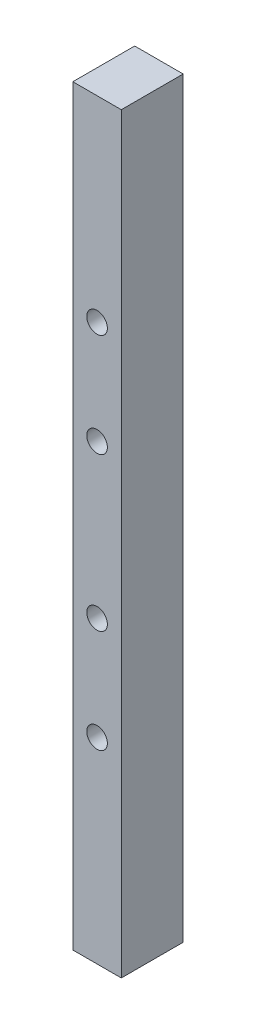
ISO-10303-21;
HEADER;
FILE_DESCRIPTION(('STEP AP214'),'2;1');
FILE_NAME('part.step','',(''),(''),'','','');
FILE_SCHEMA(('AUTOMOTIVE_DESIGN { 1 0 10303 214 1 1 1 1 }'));
ENDSEC;
DATA;
#1=APPLICATION_CONTEXT('core data for automotive mechanical design processes');
#2=APPLICATION_PROTOCOL_DEFINITION('international standard','automotive_design',2000,#1);
#3=PRODUCT_CONTEXT('',#1,'mechanical');
#4=PRODUCT('Part','Part','',(#3));
#5=PRODUCT_RELATED_PRODUCT_CATEGORY('part','',(#4));
#6=PRODUCT_DEFINITION_FORMATION('','',#4);
#7=PRODUCT_DEFINITION_CONTEXT('part definition',#1,'design');
#8=PRODUCT_DEFINITION('design','',#6,#7);
#9=PRODUCT_DEFINITION_SHAPE('','',#8);
#10=(LENGTH_UNIT() NAMED_UNIT(*) SI_UNIT(.MILLI.,.METRE.));
#11=(NAMED_UNIT(*) PLANE_ANGLE_UNIT() SI_UNIT($,.RADIAN.));
#12=(NAMED_UNIT(*) SI_UNIT($,.STERADIAN.) SOLID_ANGLE_UNIT());
#13=UNCERTAINTY_MEASURE_WITH_UNIT(LENGTH_MEASURE(1.E-05),#10,'distance_accuracy_value','');
#14=(GEOMETRIC_REPRESENTATION_CONTEXT(3) GLOBAL_UNCERTAINTY_ASSIGNED_CONTEXT((#13)) GLOBAL_UNIT_ASSIGNED_CONTEXT((#10,
#11,#12)) REPRESENTATION_CONTEXT('',''));
#15=CARTESIAN_POINT('',(0.,0.,0.));
#16=DIRECTION('',(0.,0.,1.));
#17=DIRECTION('',(1.,0.,0.));
#18=AXIS2_PLACEMENT_3D('',#15,#16,#17);
#19=CARTESIAN_POINT('',(0.,0.,6.));
#20=DIRECTION('',(0.,0.,1.));
#21=DIRECTION('',(1.,0.,0.));
#22=AXIS2_PLACEMENT_3D('',#19,#20,#21);
#23=PLANE('',#22);
#24=CARTESIAN_POINT('',(-5.66533640940846,-14.9136807914443,6.));
#25=DIRECTION('',(0.,0.,1.));
#26=DIRECTION('',(-1.,0.,0.));
#27=AXIS2_PLACEMENT_3D('',#24,#25,#26);
#28=CIRCLE('',#27,1.);
#29=CARTESIAN_POINT('',(-6.66533640940846,-14.9136807914443,6.));
#30=VERTEX_POINT('',#29);
#31=EDGE_CURVE('E121',#30,#30,#28,.T.);
#32=ORIENTED_EDGE('',*,*,#31,.F.);
#33=EDGE_LOOP('',(#32));
#34=FACE_BOUND('',#33,.T.);
#35=CARTESIAN_POINT('',(-5.66533640940846,9.94874264392457,6.));
#36=DIRECTION('',(0.,0.,1.));
#37=DIRECTION('',(1.,0.,0.));
#38=AXIS2_PLACEMENT_3D('',#35,#36,#37);
#39=CIRCLE('',#38,1.);
#40=CARTESIAN_POINT('',(-4.66533640940846,9.94874264392457,6.));
#41=VERTEX_POINT('',#40);
#42=EDGE_CURVE('E100',#41,#41,#39,.T.);
#43=ORIENTED_EDGE('',*,*,#42,.F.);
#44=EDGE_LOOP('',(#43));
#45=FACE_BOUND('',#44,.T.);
#46=DIRECTION('',(0.,1.,0.));
#47=VECTOR('',#46,1.);
#48=CARTESIAN_POINT('',(-3.31533640940846,28.9831367850824,6.));
#49=LINE('',#48,#47);
#50=CARTESIAN_POINT('',(-3.31533640940845,-43.9480749326021,6.));
#51=VERTEX_POINT('',#50);
#52=CARTESIAN_POINT('',(-3.31533640940846,28.9831367850824,6.));
#53=VERTEX_POINT('',#52);
#54=EDGE_CURVE('E85',#51,#53,#49,.T.);
#55=ORIENTED_EDGE('',*,*,#54,.T.);
#56=DIRECTION('',(-1.,0.,0.));
#57=VECTOR('',#56,1.);
#58=CARTESIAN_POINT('',(-8.01533640940846,28.9831367850824,6.));
#59=LINE('',#58,#57);
#60=CARTESIAN_POINT('',(-8.01533640940846,28.9831367850824,6.));
#61=VERTEX_POINT('',#60);
#62=EDGE_CURVE('E80',#53,#61,#59,.T.);
#63=ORIENTED_EDGE('',*,*,#62,.T.);
#64=DIRECTION('',(0.,-1.,0.));
#65=VECTOR('',#64,1.);
#66=CARTESIAN_POINT('',(-8.01533640940846,28.9831367850824,6.));
#67=LINE('',#66,#65);
#68=CARTESIAN_POINT('',(-8.01533640940846,-43.9480749326021,6.));
#69=VERTEX_POINT('',#68);
#70=EDGE_CURVE('E83',#61,#69,#67,.T.);
#71=ORIENTED_EDGE('',*,*,#70,.T.);
#72=DIRECTION('',(1.,0.,0.));
#73=VECTOR('',#72,1.);
#74=CARTESIAN_POINT('',(-8.01533640940846,-43.9480749326021,6.));
#75=LINE('',#74,#73);
#76=EDGE_CURVE('E50',#69,#51,#75,.T.);
#77=ORIENTED_EDGE('',*,*,#76,.T.);
#78=EDGE_LOOP('',(#55,#63,#71,#77));
#79=FACE_BOUND('',#78,.T.);
#80=CARTESIAN_POINT('',(-5.66533640940846,-0.0512573560754312,6.));
#81=DIRECTION('',(0.,0.,1.));
#82=DIRECTION('',(1.,0.,0.));
#83=AXIS2_PLACEMENT_3D('',#80,#81,#82);
#84=CIRCLE('',#83,1.);
#85=CARTESIAN_POINT('',(-4.66533640940846,-0.0512573560754312,6.));
#86=VERTEX_POINT('',#85);
#87=EDGE_CURVE('E115',#86,#86,#84,.T.);
#88=ORIENTED_EDGE('',*,*,#87,.F.);
#89=EDGE_LOOP('',(#88));
#90=FACE_BOUND('',#89,.T.);
#91=CARTESIAN_POINT('',(-5.66533640940846,-24.9136807914443,6.));
#92=DIRECTION('',(0.,0.,1.));
#93=DIRECTION('',(-1.,0.,0.));
#94=AXIS2_PLACEMENT_3D('',#91,#92,#93);
#95=CIRCLE('',#94,1.);
#96=CARTESIAN_POINT('',(-6.66533640940846,-24.9136807914443,6.));
#97=VERTEX_POINT('',#96);
#98=EDGE_CURVE('E127',#97,#97,#95,.T.);
#99=ORIENTED_EDGE('',*,*,#98,.F.);
#100=EDGE_LOOP('',(#99));
#101=FACE_BOUND('',#100,.T.);
#102=ADVANCED_FACE('F33',(#34,#45,#79,#90,#101),#23,.T.);
#103=CARTESIAN_POINT('',(0.,0.,0.));
#104=DIRECTION('',(0.,0.,1.));
#105=DIRECTION('',(1.,0.,0.));
#106=AXIS2_PLACEMENT_3D('',#103,#104,#105);
#107=PLANE('',#106);
#108=DIRECTION('',(0.,1.,0.));
#109=VECTOR('',#108,1.);
#110=CARTESIAN_POINT('',(-3.31533640940846,28.9831367850824,0.));
#111=LINE('',#110,#109);
#112=CARTESIAN_POINT('',(-3.31533640940845,-43.9480749326021,0.));
#113=VERTEX_POINT('',#112);
#114=CARTESIAN_POINT('',(-3.31533640940846,28.9831367850824,0.));
#115=VERTEX_POINT('',#114);
#116=EDGE_CURVE('E97',#113,#115,#111,.T.);
#117=ORIENTED_EDGE('',*,*,#116,.F.);
#118=DIRECTION('',(1.,0.,0.));
#119=VECTOR('',#118,1.);
#120=CARTESIAN_POINT('',(-8.01533640940846,-43.9480749326021,0.));
#121=LINE('',#120,#119);
#122=CARTESIAN_POINT('',(-8.01533640940846,-43.9480749326021,0.));
#123=VERTEX_POINT('',#122);
#124=EDGE_CURVE('E73',#123,#113,#121,.T.);
#125=ORIENTED_EDGE('',*,*,#124,.F.);
#126=DIRECTION('',(0.,-1.,0.));
#127=VECTOR('',#126,1.);
#128=CARTESIAN_POINT('',(-8.01533640940846,28.9831367850824,0.));
#129=LINE('',#128,#127);
#130=CARTESIAN_POINT('',(-8.01533640940846,28.9831367850824,0.));
#131=VERTEX_POINT('',#130);
#132=EDGE_CURVE('E67',#131,#123,#129,.T.);
#133=ORIENTED_EDGE('',*,*,#132,.F.);
#134=DIRECTION('',(-1.,0.,0.));
#135=VECTOR('',#134,1.);
#136=CARTESIAN_POINT('',(-8.01533640940846,28.9831367850824,0.));
#137=LINE('',#136,#135);
#138=EDGE_CURVE('E89',#115,#131,#137,.T.);
#139=ORIENTED_EDGE('',*,*,#138,.F.);
#140=EDGE_LOOP('',(#117,#125,#133,#139));
#141=FACE_BOUND('',#140,.T.);
#142=CARTESIAN_POINT('',(-5.66533640940846,9.94874264392457,0.));
#143=DIRECTION('',(0.,0.,1.));
#144=DIRECTION('',(1.,0.,0.));
#145=AXIS2_PLACEMENT_3D('',#142,#143,#144);
#146=CIRCLE('',#145,1.);
#147=CARTESIAN_POINT('',(-4.66533640940846,9.94874264392457,0.));
#148=VERTEX_POINT('',#147);
#149=EDGE_CURVE('E112',#148,#148,#146,.T.);
#150=ORIENTED_EDGE('',*,*,#149,.T.);
#151=EDGE_LOOP('',(#150));
#152=FACE_BOUND('',#151,.T.);
#153=CARTESIAN_POINT('',(-5.66533640940846,-0.0512573560754312,0.));
#154=DIRECTION('',(0.,0.,1.));
#155=DIRECTION('',(1.,0.,0.));
#156=AXIS2_PLACEMENT_3D('',#153,#154,#155);
#157=CIRCLE('',#156,1.);
#158=CARTESIAN_POINT('',(-4.66533640940846,-0.0512573560754312,0.));
#159=VERTEX_POINT('',#158);
#160=EDGE_CURVE('E118',#159,#159,#157,.T.);
#161=ORIENTED_EDGE('',*,*,#160,.T.);
#162=EDGE_LOOP('',(#161));
#163=FACE_BOUND('',#162,.T.);
#164=CARTESIAN_POINT('',(-5.66533640940846,-14.9136807914443,0.));
#165=DIRECTION('',(0.,0.,1.));
#166=DIRECTION('',(-1.,0.,0.));
#167=AXIS2_PLACEMENT_3D('',#164,#165,#166);
#168=CIRCLE('',#167,1.);
#169=CARTESIAN_POINT('',(-6.66533640940846,-14.9136807914443,0.));
#170=VERTEX_POINT('',#169);
#171=EDGE_CURVE('E124',#170,#170,#168,.T.);
#172=ORIENTED_EDGE('',*,*,#171,.T.);
#173=EDGE_LOOP('',(#172));
#174=FACE_BOUND('',#173,.T.);
#175=CARTESIAN_POINT('',(-5.66533640940846,-24.9136807914443,0.));
#176=DIRECTION('',(0.,0.,1.));
#177=DIRECTION('',(-1.,0.,0.));
#178=AXIS2_PLACEMENT_3D('',#175,#176,#177);
#179=CIRCLE('',#178,1.);
#180=CARTESIAN_POINT('',(-6.66533640940846,-24.9136807914443,0.));
#181=VERTEX_POINT('',#180);
#182=EDGE_CURVE('E130',#181,#181,#179,.T.);
#183=ORIENTED_EDGE('',*,*,#182,.T.);
#184=EDGE_LOOP('',(#183));
#185=FACE_BOUND('',#184,.T.);
#186=ADVANCED_FACE('F108',(#141,#152,#163,#174,#185),#107,.F.);
#187=CARTESIAN_POINT('',(-3.31533640940846,28.9831367850824,6.));
#188=DIRECTION('',(-1.,0.,0.));
#189=DIRECTION('',(0.,-1.,0.));
#190=AXIS2_PLACEMENT_3D('',#187,#188,#189);
#191=PLANE('',#190);
#192=ORIENTED_EDGE('',*,*,#116,.T.);
#193=DIRECTION('',(0.,0.,-1.));
#194=VECTOR('',#193,1.);
#195=CARTESIAN_POINT('',(-3.31533640940846,28.9831367850824,6.));
#196=LINE('',#195,#194);
#197=EDGE_CURVE('E11',#53,#115,#196,.T.);
#198=ORIENTED_EDGE('',*,*,#197,.F.);
#199=ORIENTED_EDGE('',*,*,#54,.F.);
#200=DIRECTION('',(0.,0.,-1.));
#201=VECTOR('',#200,1.);
#202=CARTESIAN_POINT('',(-3.31533640940845,-43.9480749326021,6.));
#203=LINE('',#202,#201);
#204=EDGE_CURVE('E93',#51,#113,#203,.T.);
#205=ORIENTED_EDGE('',*,*,#204,.T.);
#206=EDGE_LOOP('',(#192,#198,#199,#205));
#207=FACE_BOUND('',#206,.T.);
#208=ADVANCED_FACE('F35',(#207),#191,.F.);
#209=CARTESIAN_POINT('',(-8.01533640940846,28.9831367850824,6.));
#210=DIRECTION('',(0.,-1.,0.));
#211=DIRECTION('',(0.,0.,-1.));
#212=AXIS2_PLACEMENT_3D('',#209,#210,#211);
#213=PLANE('',#212);
#214=ORIENTED_EDGE('',*,*,#138,.T.);
#215=DIRECTION('',(0.,0.,-1.));
#216=VECTOR('',#215,1.);
#217=CARTESIAN_POINT('',(-8.01533640940846,28.9831367850824,6.));
#218=LINE('',#217,#216);
#219=EDGE_CURVE('E42',#61,#131,#218,.T.);
#220=ORIENTED_EDGE('',*,*,#219,.F.);
#221=ORIENTED_EDGE('',*,*,#62,.F.);
#222=ORIENTED_EDGE('',*,*,#197,.T.);
#223=EDGE_LOOP('',(#214,#220,#221,#222));
#224=FACE_BOUND('',#223,.T.);
#225=ADVANCED_FACE('F88',(#224),#213,.F.);
#226=CARTESIAN_POINT('',(-8.01533640940846,28.9831367850824,6.));
#227=DIRECTION('',(1.,0.,0.));
#228=DIRECTION('',(0.,0.,-1.));
#229=AXIS2_PLACEMENT_3D('',#226,#227,#228);
#230=PLANE('',#229);
#231=ORIENTED_EDGE('',*,*,#132,.T.);
#232=DIRECTION('',(0.,0.,-1.));
#233=VECTOR('',#232,1.);
#234=CARTESIAN_POINT('',(-8.01533640940846,-43.9480749326021,6.));
#235=LINE('',#234,#233);
#236=EDGE_CURVE('E90',#69,#123,#235,.T.);
#237=ORIENTED_EDGE('',*,*,#236,.F.);
#238=ORIENTED_EDGE('',*,*,#70,.F.);
#239=ORIENTED_EDGE('',*,*,#219,.T.);
#240=EDGE_LOOP('',(#231,#237,#238,#239));
#241=FACE_BOUND('',#240,.T.);
#242=ADVANCED_FACE('F91',(#241),#230,.F.);
#243=CARTESIAN_POINT('',(-8.01533640940846,-43.9480749326021,6.));
#244=DIRECTION('',(0.,1.,0.));
#245=DIRECTION('',(0.,0.,1.));
#246=AXIS2_PLACEMENT_3D('',#243,#244,#245);
#247=PLANE('',#246);
#248=ORIENTED_EDGE('',*,*,#124,.T.);
#249=ORIENTED_EDGE('',*,*,#204,.F.);
#250=ORIENTED_EDGE('',*,*,#76,.F.);
#251=ORIENTED_EDGE('',*,*,#236,.T.);
#252=EDGE_LOOP('',(#248,#249,#250,#251));
#253=FACE_BOUND('',#252,.T.);
#254=ADVANCED_FACE('F105',(#253),#247,.F.);
#255=CARTESIAN_POINT('',(-5.66533640940846,9.94874264392457,6.));
#256=DIRECTION('',(0.,0.,-1.));
#257=DIRECTION('',(-1.,0.,0.));
#258=AXIS2_PLACEMENT_3D('',#255,#256,#257);
#259=CYLINDRICAL_SURFACE('',#258,1.);
#260=ORIENTED_EDGE('',*,*,#42,.T.);
#261=EDGE_LOOP('',(#260));
#262=FACE_BOUND('',#261,.T.);
#263=ORIENTED_EDGE('',*,*,#149,.F.);
#264=EDGE_LOOP('',(#263));
#265=FACE_BOUND('',#264,.T.);
#266=ADVANCED_FACE('F149',(#262,#265),#259,.F.);
#267=CARTESIAN_POINT('',(-5.66533640940846,-0.0512573560754312,6.));
#268=DIRECTION('',(0.,0.,-1.));
#269=DIRECTION('',(-1.,0.,0.));
#270=AXIS2_PLACEMENT_3D('',#267,#268,#269);
#271=CYLINDRICAL_SURFACE('',#270,1.);
#272=ORIENTED_EDGE('',*,*,#87,.T.);
#273=EDGE_LOOP('',(#272));
#274=FACE_BOUND('',#273,.T.);
#275=ORIENTED_EDGE('',*,*,#160,.F.);
#276=EDGE_LOOP('',(#275));
#277=FACE_BOUND('',#276,.T.);
#278=ADVANCED_FACE('F195',(#274,#277),#271,.F.);
#279=CARTESIAN_POINT('',(-5.66533640940846,-14.9136807914443,6.));
#280=DIRECTION('',(0.,0.,-1.));
#281=DIRECTION('',(-1.,0.,0.));
#282=AXIS2_PLACEMENT_3D('',#279,#280,#281);
#283=CYLINDRICAL_SURFACE('',#282,1.);
#284=ORIENTED_EDGE('',*,*,#31,.T.);
#285=EDGE_LOOP('',(#284));
#286=FACE_BOUND('',#285,.T.);
#287=ORIENTED_EDGE('',*,*,#171,.F.);
#288=EDGE_LOOP('',(#287));
#289=FACE_BOUND('',#288,.T.);
#290=ADVANCED_FACE('F203',(#286,#289),#283,.F.);
#291=CARTESIAN_POINT('',(-5.66533640940846,-24.9136807914443,6.));
#292=DIRECTION('',(0.,0.,-1.));
#293=DIRECTION('',(-1.,0.,0.));
#294=AXIS2_PLACEMENT_3D('',#291,#292,#293);
#295=CYLINDRICAL_SURFACE('',#294,1.);
#296=ORIENTED_EDGE('',*,*,#98,.T.);
#297=EDGE_LOOP('',(#296));
#298=FACE_BOUND('',#297,.T.);
#299=ORIENTED_EDGE('',*,*,#182,.F.);
#300=EDGE_LOOP('',(#299));
#301=FACE_BOUND('',#300,.T.);
#302=ADVANCED_FACE('F136',(#298,#301),#295,.F.);
#303=CLOSED_SHELL('',(#102,#186,#208,#225,#242,#254,#266,#278,#290,#302));
#304=MANIFOLD_SOLID_BREP('B2',#303);
#305=ADVANCED_BREP_SHAPE_REPRESENTATION('',(#18,#304),#14);
#306=SHAPE_DEFINITION_REPRESENTATION(#9,#305);
ENDSEC;
END-ISO-10303-21;
